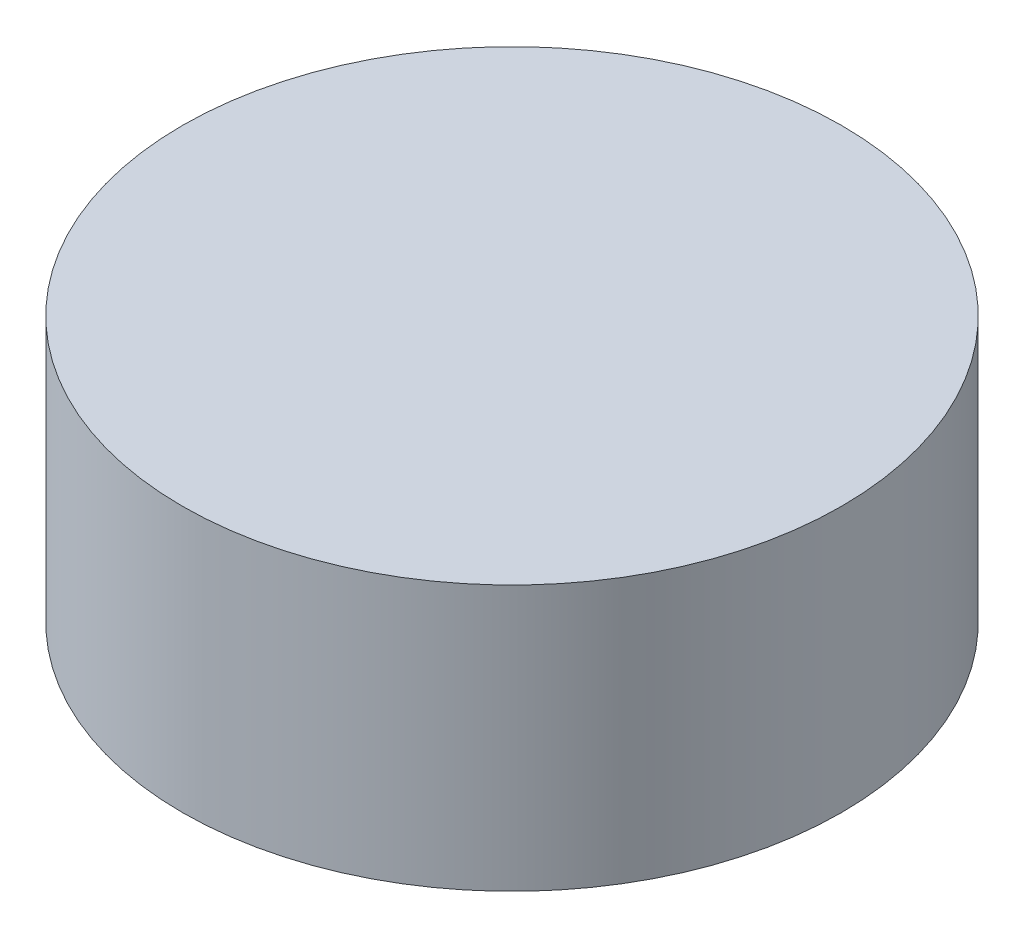
ISO-10303-21;
HEADER;
FILE_DESCRIPTION(('STEP AP214'),'2;1');
FILE_NAME('part.step','',(''),(''),'','','');
FILE_SCHEMA(('AUTOMOTIVE_DESIGN { 1 0 10303 214 1 1 1 1 }'));
ENDSEC;
DATA;
#1=APPLICATION_CONTEXT('core data for automotive mechanical design processes');
#2=APPLICATION_PROTOCOL_DEFINITION('international standard','automotive_design',2000,#1);
#3=PRODUCT_CONTEXT('',#1,'mechanical');
#4=PRODUCT('Part','Part','',(#3));
#5=PRODUCT_RELATED_PRODUCT_CATEGORY('part','',(#4));
#6=PRODUCT_DEFINITION_FORMATION('','',#4);
#7=PRODUCT_DEFINITION_CONTEXT('part definition',#1,'design');
#8=PRODUCT_DEFINITION('design','',#6,#7);
#9=PRODUCT_DEFINITION_SHAPE('','',#8);
#10=(LENGTH_UNIT() NAMED_UNIT(*) SI_UNIT(.MILLI.,.METRE.));
#11=(NAMED_UNIT(*) PLANE_ANGLE_UNIT() SI_UNIT($,.RADIAN.));
#12=(NAMED_UNIT(*) SI_UNIT($,.STERADIAN.) SOLID_ANGLE_UNIT());
#13=UNCERTAINTY_MEASURE_WITH_UNIT(LENGTH_MEASURE(1.E-05),#10,'distance_accuracy_value','');
#14=(GEOMETRIC_REPRESENTATION_CONTEXT(3) GLOBAL_UNCERTAINTY_ASSIGNED_CONTEXT((#13)) GLOBAL_UNIT_ASSIGNED_CONTEXT((#10,
#11,#12)) REPRESENTATION_CONTEXT('',''));
#15=CARTESIAN_POINT('',(0.,0.,0.));
#16=DIRECTION('',(0.,0.,1.));
#17=DIRECTION('',(1.,0.,0.));
#18=AXIS2_PLACEMENT_3D('',#15,#16,#17);
#19=CARTESIAN_POINT('',(0.,0.,0.));
#20=DIRECTION('',(0.,1.,0.));
#21=DIRECTION('',(0.,0.,1.));
#22=AXIS2_PLACEMENT_3D('',#19,#20,#21);
#23=PLANE('',#22);
#24=CARTESIAN_POINT('',(0.,0.,0.));
#25=DIRECTION('',(0.,1.,0.));
#26=DIRECTION('',(0.,0.,1.));
#27=AXIS2_PLACEMENT_3D('',#24,#25,#26);
#28=CIRCLE('',#27,43.5);
#29=CARTESIAN_POINT('',(0.,0.,43.5));
#30=VERTEX_POINT('',#29);
#31=EDGE_CURVE('E10',#30,#30,#28,.T.);
#32=ORIENTED_EDGE('',*,*,#31,.F.);
#33=EDGE_LOOP('',(#32));
#34=FACE_BOUND('',#33,.T.);
#35=CARTESIAN_POINT('',(0.,0.,0.));
#36=DIRECTION('',(0.,1.,0.));
#37=DIRECTION('',(0.,0.,1.));
#38=AXIS2_PLACEMENT_3D('',#35,#36,#37);
#39=CIRCLE('',#38,42.);
#40=CARTESIAN_POINT('',(0.,0.,42.));
#41=VERTEX_POINT('',#40);
#42=EDGE_CURVE('E37',#41,#41,#39,.T.);
#43=ORIENTED_EDGE('',*,*,#42,.T.);
#44=EDGE_LOOP('',(#43));
#45=FACE_BOUND('',#44,.T.);
#46=ADVANCED_FACE('F30',(#34,#45),#23,.F.);
#47=CARTESIAN_POINT('',(0.,32.,0.));
#48=DIRECTION('',(0.,-1.,0.));
#49=DIRECTION('',(0.,0.,-1.));
#50=AXIS2_PLACEMENT_3D('',#47,#48,#49);
#51=CYLINDRICAL_SURFACE('',#50,43.5);
#52=ORIENTED_EDGE('',*,*,#31,.T.);
#53=EDGE_LOOP('',(#52));
#54=FACE_BOUND('',#53,.T.);
#55=CARTESIAN_POINT('',(0.,35.,0.));
#56=DIRECTION('',(0.,1.,0.));
#57=DIRECTION('',(0.,0.,1.));
#58=AXIS2_PLACEMENT_3D('',#55,#56,#57);
#59=CIRCLE('',#58,43.5);
#60=CARTESIAN_POINT('',(0.,35.,43.5));
#61=VERTEX_POINT('',#60);
#62=EDGE_CURVE('E45',#61,#61,#59,.T.);
#63=ORIENTED_EDGE('',*,*,#62,.F.);
#64=EDGE_LOOP('',(#63));
#65=FACE_BOUND('',#64,.T.);
#66=ADVANCED_FACE('F32',(#54,#65),#51,.T.);
#67=CARTESIAN_POINT('',(0.,32.,0.));
#68=DIRECTION('',(0.,-1.,0.));
#69=DIRECTION('',(0.,0.,-1.));
#70=AXIS2_PLACEMENT_3D('',#67,#68,#69);
#71=CYLINDRICAL_SURFACE('',#70,42.);
#72=CARTESIAN_POINT('',(0.,32.,0.));
#73=DIRECTION('',(0.,1.,0.));
#74=DIRECTION('',(0.,0.,1.));
#75=AXIS2_PLACEMENT_3D('',#72,#73,#74);
#76=CIRCLE('',#75,42.);
#77=CARTESIAN_POINT('',(0.,32.,42.));
#78=VERTEX_POINT('',#77);
#79=EDGE_CURVE('E41',#78,#78,#76,.T.);
#80=ORIENTED_EDGE('',*,*,#79,.T.);
#81=EDGE_LOOP('',(#80));
#82=FACE_BOUND('',#81,.T.);
#83=ORIENTED_EDGE('',*,*,#42,.F.);
#84=EDGE_LOOP('',(#83));
#85=FACE_BOUND('',#84,.T.);
#86=ADVANCED_FACE('F54',(#82,#85),#71,.F.);
#87=CARTESIAN_POINT('',(0.,32.,0.));
#88=DIRECTION('',(0.,1.,0.));
#89=DIRECTION('',(0.,0.,1.));
#90=AXIS2_PLACEMENT_3D('',#87,#88,#89);
#91=PLANE('',#90);
#92=ORIENTED_EDGE('',*,*,#79,.F.);
#93=EDGE_LOOP('',(#92));
#94=FACE_BOUND('',#93,.T.);
#95=ADVANCED_FACE('F59',(#94),#91,.F.);
#96=CARTESIAN_POINT('',(0.,35.,0.));
#97=DIRECTION('',(0.,1.,0.));
#98=DIRECTION('',(0.,0.,1.));
#99=AXIS2_PLACEMENT_3D('',#96,#97,#98);
#100=PLANE('',#99);
#101=ORIENTED_EDGE('',*,*,#62,.T.);
#102=EDGE_LOOP('',(#101));
#103=FACE_BOUND('',#102,.T.);
#104=ADVANCED_FACE('F51',(#103),#100,.T.);
#105=CLOSED_SHELL('',(#46,#66,#86,#95,#104));
#106=MANIFOLD_SOLID_BREP('B2',#105);
#107=ADVANCED_BREP_SHAPE_REPRESENTATION('',(#18,#106),#14);
#108=SHAPE_DEFINITION_REPRESENTATION(#9,#107);
ENDSEC;
END-ISO-10303-21;
